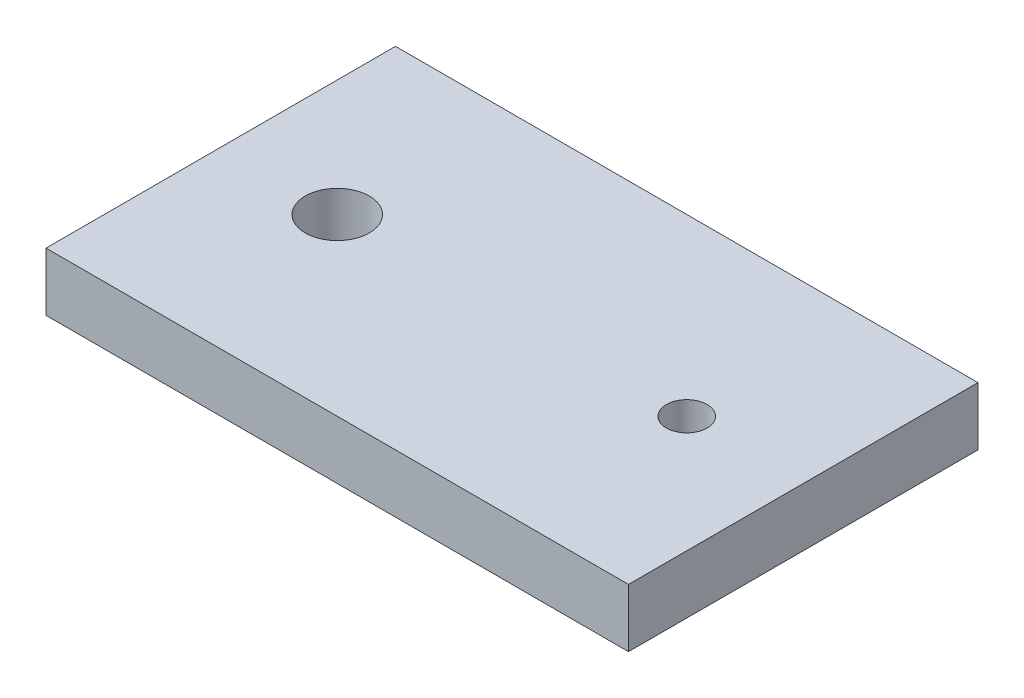
ISO-10303-21;
HEADER;
FILE_DESCRIPTION(('STEP AP214'),'2;1');
FILE_NAME('part.step','',(''),(''),'','','');
FILE_SCHEMA(('AUTOMOTIVE_DESIGN { 1 0 10303 214 1 1 1 1 }'));
ENDSEC;
DATA;
#1=APPLICATION_CONTEXT('core data for automotive mechanical design processes');
#2=APPLICATION_PROTOCOL_DEFINITION('international standard','automotive_design',2000,#1);
#3=PRODUCT_CONTEXT('',#1,'mechanical');
#4=PRODUCT('Part','Part','',(#3));
#5=PRODUCT_RELATED_PRODUCT_CATEGORY('part','',(#4));
#6=PRODUCT_DEFINITION_FORMATION('','',#4);
#7=PRODUCT_DEFINITION_CONTEXT('part definition',#1,'design');
#8=PRODUCT_DEFINITION('design','',#6,#7);
#9=PRODUCT_DEFINITION_SHAPE('','',#8);
#10=(LENGTH_UNIT() NAMED_UNIT(*) SI_UNIT(.MILLI.,.METRE.));
#11=(NAMED_UNIT(*) PLANE_ANGLE_UNIT() SI_UNIT($,.RADIAN.));
#12=(NAMED_UNIT(*) SI_UNIT($,.STERADIAN.) SOLID_ANGLE_UNIT());
#13=UNCERTAINTY_MEASURE_WITH_UNIT(LENGTH_MEASURE(1.E-05),#10,'distance_accuracy_value','');
#14=(GEOMETRIC_REPRESENTATION_CONTEXT(3) GLOBAL_UNCERTAINTY_ASSIGNED_CONTEXT((#13)) GLOBAL_UNIT_ASSIGNED_CONTEXT((#10,
#11,#12)) REPRESENTATION_CONTEXT('',''));
#15=CARTESIAN_POINT('',(0.,0.,0.));
#16=DIRECTION('',(0.,0.,1.));
#17=DIRECTION('',(1.,0.,0.));
#18=AXIS2_PLACEMENT_3D('',#15,#16,#17);
#19=CARTESIAN_POINT('',(0.,5.,0.));
#20=DIRECTION('',(0.,1.,0.));
#21=DIRECTION('',(0.,0.,1.));
#22=AXIS2_PLACEMENT_3D('',#19,#20,#21);
#23=PLANE('',#22);
#24=CARTESIAN_POINT('',(-14.1312741312741,5.,2.11389961389961));
#25=DIRECTION('',(0.,1.,0.));
#26=DIRECTION('',(0.,0.,1.));
#27=AXIS2_PLACEMENT_3D('',#24,#25,#26);
#28=CIRCLE('',#27,2.75);
#29=CARTESIAN_POINT('',(-14.1312741312741,5.,4.86389961389961));
#30=VERTEX_POINT('',#29);
#31=EDGE_CURVE('E112',#30,#30,#28,.T.);
#32=ORIENTED_EDGE('',*,*,#31,.F.);
#33=EDGE_LOOP('',(#32));
#34=FACE_BOUND('',#33,.T.);
#35=DIRECTION('',(0.,0.,1.));
#36=VECTOR('',#35,1.);
#37=CARTESIAN_POINT('',(-24.1312741312741,5.,-12.8861003861004));
#38=LINE('',#37,#36);
#39=CARTESIAN_POINT('',(-24.1312741312741,5.,-12.8861003861004));
#40=VERTEX_POINT('',#39);
#41=CARTESIAN_POINT('',(-24.1312741312741,5.,17.1138996138996));
#42=VERTEX_POINT('',#41);
#43=EDGE_CURVE('E92',#40,#42,#38,.T.);
#44=ORIENTED_EDGE('',*,*,#43,.T.);
#45=DIRECTION('',(1.,0.,0.));
#46=VECTOR('',#45,1.);
#47=CARTESIAN_POINT('',(-24.1312741312741,5.,17.1138996138996));
#48=LINE('',#47,#46);
#49=CARTESIAN_POINT('',(25.8687258687259,5.,17.1138996138996));
#50=VERTEX_POINT('',#49);
#51=EDGE_CURVE('E87',#42,#50,#48,.T.);
#52=ORIENTED_EDGE('',*,*,#51,.T.);
#53=DIRECTION('',(0.,0.,-1.));
#54=VECTOR('',#53,1.);
#55=CARTESIAN_POINT('',(25.8687258687259,5.,-12.8861003861004));
#56=LINE('',#55,#54);
#57=CARTESIAN_POINT('',(25.8687258687259,5.,-12.8861003861004));
#58=VERTEX_POINT('',#57);
#59=EDGE_CURVE('E90',#50,#58,#56,.T.);
#60=ORIENTED_EDGE('',*,*,#59,.T.);
#61=DIRECTION('',(-1.,0.,0.));
#62=VECTOR('',#61,1.);
#63=CARTESIAN_POINT('',(-24.1312741312741,5.,-12.8861003861004));
#64=LINE('',#63,#62);
#65=EDGE_CURVE('E57',#58,#40,#64,.T.);
#66=ORIENTED_EDGE('',*,*,#65,.T.);
#67=EDGE_LOOP('',(#44,#52,#60,#66));
#68=FACE_BOUND('',#67,.T.);
#69=CARTESIAN_POINT('',(15.8687258687259,5.,2.11389961389961));
#70=DIRECTION('',(0.,1.,0.));
#71=DIRECTION('',(0.,0.,1.));
#72=AXIS2_PLACEMENT_3D('',#69,#70,#71);
#73=CIRCLE('',#72,1.75);
#74=CARTESIAN_POINT('',(15.8687258687259,5.,3.86389961389961));
#75=VERTEX_POINT('',#74);
#76=EDGE_CURVE('E134',#75,#75,#73,.T.);
#77=ORIENTED_EDGE('',*,*,#76,.F.);
#78=EDGE_LOOP('',(#77));
#79=FACE_BOUND('',#78,.T.);
#80=ADVANCED_FACE('F39',(#34,#68,#79),#23,.T.);
#81=CARTESIAN_POINT('',(0.,0.,0.));
#82=DIRECTION('',(0.,1.,0.));
#83=DIRECTION('',(0.,0.,1.));
#84=AXIS2_PLACEMENT_3D('',#81,#82,#83);
#85=PLANE('',#84);
#86=DIRECTION('',(0.,0.,1.));
#87=VECTOR('',#86,1.);
#88=CARTESIAN_POINT('',(-24.1312741312741,0.,-12.8861003861004));
#89=LINE('',#88,#87);
#90=CARTESIAN_POINT('',(-24.1312741312741,0.,-12.8861003861004));
#91=VERTEX_POINT('',#90);
#92=CARTESIAN_POINT('',(-24.1312741312741,0.,17.1138996138996));
#93=VERTEX_POINT('',#92);
#94=EDGE_CURVE('E108',#91,#93,#89,.T.);
#95=ORIENTED_EDGE('',*,*,#94,.F.);
#96=DIRECTION('',(-1.,0.,0.));
#97=VECTOR('',#96,1.);
#98=CARTESIAN_POINT('',(-24.1312741312741,0.,-12.8861003861004));
#99=LINE('',#98,#97);
#100=CARTESIAN_POINT('',(25.8687258687259,0.,-12.8861003861004));
#101=VERTEX_POINT('',#100);
#102=EDGE_CURVE('E80',#101,#91,#99,.T.);
#103=ORIENTED_EDGE('',*,*,#102,.F.);
#104=DIRECTION('',(0.,0.,-1.));
#105=VECTOR('',#104,1.);
#106=CARTESIAN_POINT('',(25.8687258687259,0.,-12.8861003861004));
#107=LINE('',#106,#105);
#108=CARTESIAN_POINT('',(25.8687258687259,0.,17.1138996138996));
#109=VERTEX_POINT('',#108);
#110=EDGE_CURVE('E74',#109,#101,#107,.T.);
#111=ORIENTED_EDGE('',*,*,#110,.F.);
#112=DIRECTION('',(1.,0.,0.));
#113=VECTOR('',#112,1.);
#114=CARTESIAN_POINT('',(-24.1312741312741,0.,17.1138996138996));
#115=LINE('',#114,#113);
#116=EDGE_CURVE('E97',#93,#109,#115,.T.);
#117=ORIENTED_EDGE('',*,*,#116,.F.);
#118=EDGE_LOOP('',(#95,#103,#111,#117));
#119=FACE_BOUND('',#118,.T.);
#120=CARTESIAN_POINT('',(-14.1312741312741,0.,2.11389961389961));
#121=DIRECTION('',(0.,1.,0.));
#122=DIRECTION('',(0.,0.,1.));
#123=AXIS2_PLACEMENT_3D('',#120,#121,#122);
#124=CIRCLE('',#123,2.75);
#125=CARTESIAN_POINT('',(-14.1312741312741,0.,4.86389961389961));
#126=VERTEX_POINT('',#125);
#127=EDGE_CURVE('E130',#126,#126,#124,.T.);
#128=ORIENTED_EDGE('',*,*,#127,.T.);
#129=EDGE_LOOP('',(#128));
#130=FACE_BOUND('',#129,.T.);
#131=CARTESIAN_POINT('',(15.8687258687259,0.,2.11389961389961));
#132=DIRECTION('',(0.,1.,0.));
#133=DIRECTION('',(0.,0.,1.));
#134=AXIS2_PLACEMENT_3D('',#131,#132,#133);
#135=CIRCLE('',#134,1.75);
#136=CARTESIAN_POINT('',(15.8687258687259,0.,3.86389961389961));
#137=VERTEX_POINT('',#136);
#138=EDGE_CURVE('E138',#137,#137,#135,.T.);
#139=ORIENTED_EDGE('',*,*,#138,.T.);
#140=EDGE_LOOP('',(#139));
#141=FACE_BOUND('',#140,.T.);
#142=ADVANCED_FACE('F125',(#119,#130,#141),#85,.F.);
#143=CARTESIAN_POINT('',(-24.1312741312741,5.,-12.8861003861004));
#144=DIRECTION('',(1.,0.,0.));
#145=DIRECTION('',(0.,0.,-1.));
#146=AXIS2_PLACEMENT_3D('',#143,#144,#145);
#147=PLANE('',#146);
#148=ORIENTED_EDGE('',*,*,#94,.T.);
#149=DIRECTION('',(0.,-1.,0.));
#150=VECTOR('',#149,1.);
#151=CARTESIAN_POINT('',(-24.1312741312741,5.,17.1138996138996));
#152=LINE('',#151,#150);
#153=EDGE_CURVE('E11',#42,#93,#152,.T.);
#154=ORIENTED_EDGE('',*,*,#153,.F.);
#155=ORIENTED_EDGE('',*,*,#43,.F.);
#156=DIRECTION('',(0.,-1.,0.));
#157=VECTOR('',#156,1.);
#158=CARTESIAN_POINT('',(-24.1312741312741,5.,-12.8861003861004));
#159=LINE('',#158,#157);
#160=EDGE_CURVE('E104',#40,#91,#159,.T.);
#161=ORIENTED_EDGE('',*,*,#160,.T.);
#162=EDGE_LOOP('',(#148,#154,#155,#161));
#163=FACE_BOUND('',#162,.T.);
#164=ADVANCED_FACE('F41',(#163),#147,.F.);
#165=CARTESIAN_POINT('',(-24.1312741312741,5.,17.1138996138996));
#166=DIRECTION('',(0.,0.,-1.));
#167=DIRECTION('',(-1.,0.,0.));
#168=AXIS2_PLACEMENT_3D('',#165,#166,#167);
#169=PLANE('',#168);
#170=ORIENTED_EDGE('',*,*,#116,.T.);
#171=DIRECTION('',(0.,-1.,0.));
#172=VECTOR('',#171,1.);
#173=CARTESIAN_POINT('',(25.8687258687259,5.,17.1138996138996));
#174=LINE('',#173,#172);
#175=EDGE_CURVE('E49',#50,#109,#174,.T.);
#176=ORIENTED_EDGE('',*,*,#175,.F.);
#177=ORIENTED_EDGE('',*,*,#51,.F.);
#178=ORIENTED_EDGE('',*,*,#153,.T.);
#179=EDGE_LOOP('',(#170,#176,#177,#178));
#180=FACE_BOUND('',#179,.T.);
#181=ADVANCED_FACE('F96',(#180),#169,.F.);
#182=CARTESIAN_POINT('',(25.8687258687259,5.,-12.8861003861004));
#183=DIRECTION('',(-1.,0.,0.));
#184=DIRECTION('',(0.,0.,1.));
#185=AXIS2_PLACEMENT_3D('',#182,#183,#184);
#186=PLANE('',#185);
#187=ORIENTED_EDGE('',*,*,#110,.T.);
#188=DIRECTION('',(0.,-1.,0.));
#189=VECTOR('',#188,1.);
#190=CARTESIAN_POINT('',(25.8687258687259,5.,-12.8861003861004));
#191=LINE('',#190,#189);
#192=EDGE_CURVE('E99',#58,#101,#191,.T.);
#193=ORIENTED_EDGE('',*,*,#192,.F.);
#194=ORIENTED_EDGE('',*,*,#59,.F.);
#195=ORIENTED_EDGE('',*,*,#175,.T.);
#196=EDGE_LOOP('',(#187,#193,#194,#195));
#197=FACE_BOUND('',#196,.T.);
#198=ADVANCED_FACE('F100',(#197),#186,.F.);
#199=CARTESIAN_POINT('',(-24.1312741312741,5.,-12.8861003861004));
#200=DIRECTION('',(0.,0.,1.));
#201=DIRECTION('',(1.,0.,0.));
#202=AXIS2_PLACEMENT_3D('',#199,#200,#201);
#203=PLANE('',#202);
#204=ORIENTED_EDGE('',*,*,#102,.T.);
#205=ORIENTED_EDGE('',*,*,#160,.F.);
#206=ORIENTED_EDGE('',*,*,#65,.F.);
#207=ORIENTED_EDGE('',*,*,#192,.T.);
#208=EDGE_LOOP('',(#204,#205,#206,#207));
#209=FACE_BOUND('',#208,.T.);
#210=ADVANCED_FACE('F122',(#209),#203,.F.);
#211=CARTESIAN_POINT('',(-14.1312741312741,5.,2.11389961389961));
#212=DIRECTION('',(0.,-1.,0.));
#213=DIRECTION('',(0.,0.,-1.));
#214=AXIS2_PLACEMENT_3D('',#211,#212,#213);
#215=CYLINDRICAL_SURFACE('',#214,2.75);
#216=ORIENTED_EDGE('',*,*,#31,.T.);
#217=EDGE_LOOP('',(#216));
#218=FACE_BOUND('',#217,.T.);
#219=ORIENTED_EDGE('',*,*,#127,.F.);
#220=EDGE_LOOP('',(#219));
#221=FACE_BOUND('',#220,.T.);
#222=ADVANCED_FACE('F157',(#218,#221),#215,.F.);
#223=CARTESIAN_POINT('',(15.8687258687259,5.,2.11389961389961));
#224=DIRECTION('',(0.,-1.,0.));
#225=DIRECTION('',(0.,0.,-1.));
#226=AXIS2_PLACEMENT_3D('',#223,#224,#225);
#227=CYLINDRICAL_SURFACE('',#226,1.75);
#228=ORIENTED_EDGE('',*,*,#76,.T.);
#229=EDGE_LOOP('',(#228));
#230=FACE_BOUND('',#229,.T.);
#231=ORIENTED_EDGE('',*,*,#138,.F.);
#232=EDGE_LOOP('',(#231));
#233=FACE_BOUND('',#232,.T.);
#234=ADVANCED_FACE('F146',(#230,#233),#227,.F.);
#235=CLOSED_SHELL('',(#80,#142,#164,#181,#198,#210,#222,#234));
#236=MANIFOLD_SOLID_BREP('B2',#235);
#237=ADVANCED_BREP_SHAPE_REPRESENTATION('',(#18,#236),#14);
#238=SHAPE_DEFINITION_REPRESENTATION(#9,#237);
ENDSEC;
END-ISO-10303-21;
